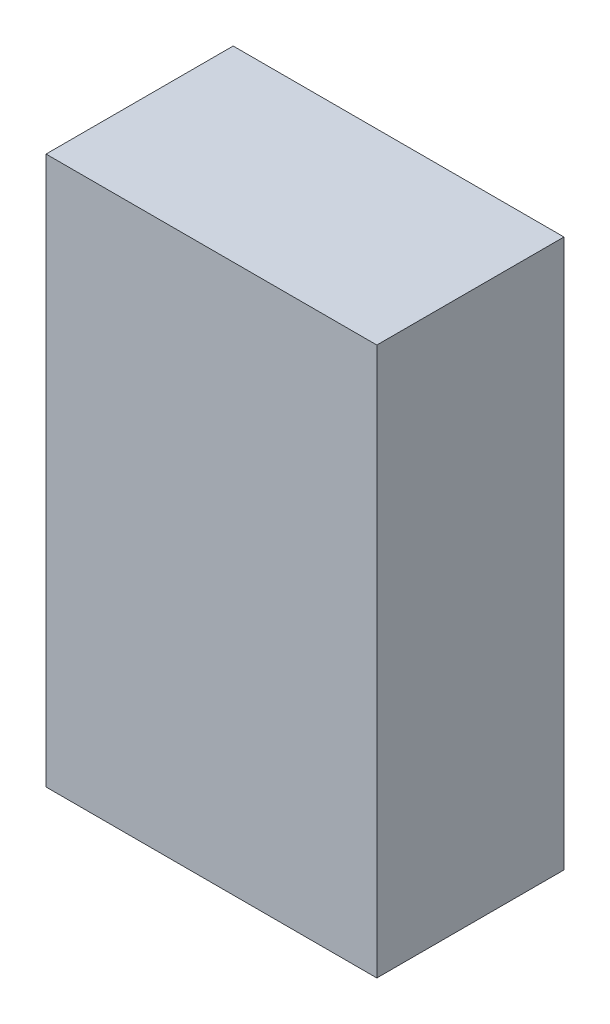
ISO-10303-21;
HEADER;
FILE_DESCRIPTION(('STEP AP214'),'2;1');
FILE_NAME('part.step','',(''),(''),'','','');
FILE_SCHEMA(('AUTOMOTIVE_DESIGN { 1 0 10303 214 1 1 1 1 }'));
ENDSEC;
DATA;
#1=APPLICATION_CONTEXT('core data for automotive mechanical design processes');
#2=APPLICATION_PROTOCOL_DEFINITION('international standard','automotive_design',2000,#1);
#3=PRODUCT_CONTEXT('',#1,'mechanical');
#4=PRODUCT('Part','Part','',(#3));
#5=PRODUCT_RELATED_PRODUCT_CATEGORY('part','',(#4));
#6=PRODUCT_DEFINITION_FORMATION('','',#4);
#7=PRODUCT_DEFINITION_CONTEXT('part definition',#1,'design');
#8=PRODUCT_DEFINITION('design','',#6,#7);
#9=PRODUCT_DEFINITION_SHAPE('','',#8);
#10=(LENGTH_UNIT() NAMED_UNIT(*) SI_UNIT(.MILLI.,.METRE.));
#11=(NAMED_UNIT(*) PLANE_ANGLE_UNIT() SI_UNIT($,.RADIAN.));
#12=(NAMED_UNIT(*) SI_UNIT($,.STERADIAN.) SOLID_ANGLE_UNIT());
#13=UNCERTAINTY_MEASURE_WITH_UNIT(LENGTH_MEASURE(1.E-05),#10,'distance_accuracy_value','');
#14=(GEOMETRIC_REPRESENTATION_CONTEXT(3) GLOBAL_UNCERTAINTY_ASSIGNED_CONTEXT((#13)) GLOBAL_UNIT_ASSIGNED_CONTEXT((#10,
#11,#12)) REPRESENTATION_CONTEXT('',''));
#15=CARTESIAN_POINT('',(0.,0.,0.));
#16=DIRECTION('',(0.,0.,1.));
#17=DIRECTION('',(1.,0.,0.));
#18=AXIS2_PLACEMENT_3D('',#15,#16,#17);
#19=CARTESIAN_POINT('',(0.87499952,1.44999964,0.00999998));
#20=DIRECTION('',(1.,0.,0.));
#21=DIRECTION('',(0.,-1.,0.));
#22=AXIS2_PLACEMENT_3D('',#19,#20,#21);
#23=PLANE('',#22);
#24=DIRECTION('',(0.,0.,1.));
#25=VECTOR('',#24,1.);
#26=CARTESIAN_POINT('',(0.87499952,1.44999964,0.00999998));
#27=LINE('',#26,#25);
#28=CARTESIAN_POINT('',(0.87499952,1.44999964,0.00999998));
#29=VERTEX_POINT('',#28);
#30=CARTESIAN_POINT('',(0.87499952,1.44999964,1.00000054));
#31=VERTEX_POINT('',#30);
#32=EDGE_CURVE('E10',#29,#31,#27,.T.);
#33=ORIENTED_EDGE('',*,*,#32,.T.);
#34=DIRECTION('',(0.,-1.,0.));
#35=VECTOR('',#34,1.);
#36=CARTESIAN_POINT('',(0.87499952,1.44999964,1.00000054));
#37=LINE('',#36,#35);
#38=CARTESIAN_POINT('',(0.87499952,-1.44999964,1.00000054));
#39=VERTEX_POINT('',#38);
#40=EDGE_CURVE('E23',#31,#39,#37,.T.);
#41=ORIENTED_EDGE('',*,*,#40,.T.);
#42=DIRECTION('',(0.,0.,1.));
#43=VECTOR('',#42,1.);
#44=CARTESIAN_POINT('',(0.87499952,-1.44999964,0.00999998));
#45=LINE('',#44,#43);
#46=CARTESIAN_POINT('',(0.87499952,-1.44999964,0.00999998));
#47=VERTEX_POINT('',#46);
#48=EDGE_CURVE('E83',#47,#39,#45,.T.);
#49=ORIENTED_EDGE('',*,*,#48,.F.);
#50=DIRECTION('',(0.,-1.,0.));
#51=VECTOR('',#50,1.);
#52=CARTESIAN_POINT('',(0.87499952,1.44999964,0.00999998));
#53=LINE('',#52,#51);
#54=EDGE_CURVE('E81',#29,#47,#53,.T.);
#55=ORIENTED_EDGE('',*,*,#54,.F.);
#56=EDGE_LOOP('',(#33,#41,#49,#55));
#57=FACE_BOUND('',#56,.T.);
#58=ADVANCED_FACE('F16',(#57),#23,.T.);
#59=CARTESIAN_POINT('',(0.87499952,-1.44999964,0.00999998));
#60=DIRECTION('',(0.,-1.,0.));
#61=DIRECTION('',(-1.,0.,0.));
#62=AXIS2_PLACEMENT_3D('',#59,#60,#61);
#63=PLANE('',#62);
#64=ORIENTED_EDGE('',*,*,#48,.T.);
#65=DIRECTION('',(-1.,0.,0.));
#66=VECTOR('',#65,1.);
#67=CARTESIAN_POINT('',(0.87499952,-1.44999964,1.00000054));
#68=LINE('',#67,#66);
#69=CARTESIAN_POINT('',(-0.87499952,-1.44999964,1.00000054));
#70=VERTEX_POINT('',#69);
#71=EDGE_CURVE('E78',#39,#70,#68,.T.);
#72=ORIENTED_EDGE('',*,*,#71,.T.);
#73=DIRECTION('',(0.,0.,1.));
#74=VECTOR('',#73,1.);
#75=CARTESIAN_POINT('',(-0.87499952,-1.44999964,0.00999998));
#76=LINE('',#75,#74);
#77=CARTESIAN_POINT('',(-0.87499952,-1.44999964,0.00999998));
#78=VERTEX_POINT('',#77);
#79=EDGE_CURVE('E76',#78,#70,#76,.T.);
#80=ORIENTED_EDGE('',*,*,#79,.F.);
#81=DIRECTION('',(-1.,0.,0.));
#82=VECTOR('',#81,1.);
#83=CARTESIAN_POINT('',(0.87499952,-1.44999964,0.00999998));
#84=LINE('',#83,#82);
#85=EDGE_CURVE('E67',#47,#78,#84,.T.);
#86=ORIENTED_EDGE('',*,*,#85,.F.);
#87=EDGE_LOOP('',(#64,#72,#80,#86));
#88=FACE_BOUND('',#87,.T.);
#89=ADVANCED_FACE('F89',(#88),#63,.T.);
#90=CARTESIAN_POINT('',(-0.87499952,-1.44999964,0.00999998));
#91=DIRECTION('',(-1.,0.,0.));
#92=DIRECTION('',(0.,1.,0.));
#93=AXIS2_PLACEMENT_3D('',#90,#91,#92);
#94=PLANE('',#93);
#95=ORIENTED_EDGE('',*,*,#79,.T.);
#96=DIRECTION('',(0.,1.,0.));
#97=VECTOR('',#96,1.);
#98=CARTESIAN_POINT('',(-0.87499952,-1.44999964,1.00000054));
#99=LINE('',#98,#97);
#100=CARTESIAN_POINT('',(-0.87499952,1.44999964,1.00000054));
#101=VERTEX_POINT('',#100);
#102=EDGE_CURVE('E59',#70,#101,#99,.T.);
#103=ORIENTED_EDGE('',*,*,#102,.T.);
#104=DIRECTION('',(0.,0.,1.));
#105=VECTOR('',#104,1.);
#106=CARTESIAN_POINT('',(-0.87499952,1.44999964,0.00999998));
#107=LINE('',#106,#105);
#108=CARTESIAN_POINT('',(-0.87499952,1.44999964,0.00999998));
#109=VERTEX_POINT('',#108);
#110=EDGE_CURVE('E53',#109,#101,#107,.T.);
#111=ORIENTED_EDGE('',*,*,#110,.F.);
#112=DIRECTION('',(0.,1.,0.));
#113=VECTOR('',#112,1.);
#114=CARTESIAN_POINT('',(-0.87499952,-1.44999964,0.00999998));
#115=LINE('',#114,#113);
#116=EDGE_CURVE('E57',#78,#109,#115,.T.);
#117=ORIENTED_EDGE('',*,*,#116,.F.);
#118=EDGE_LOOP('',(#95,#103,#111,#117));
#119=FACE_BOUND('',#118,.T.);
#120=ADVANCED_FACE('F56',(#119),#94,.T.);
#121=CARTESIAN_POINT('',(-0.87499952,1.44999964,0.00999998));
#122=DIRECTION('',(0.,1.,0.));
#123=DIRECTION('',(1.,0.,0.));
#124=AXIS2_PLACEMENT_3D('',#121,#122,#123);
#125=PLANE('',#124);
#126=ORIENTED_EDGE('',*,*,#110,.T.);
#127=DIRECTION('',(1.,0.,0.));
#128=VECTOR('',#127,1.);
#129=CARTESIAN_POINT('',(-0.87499952,1.44999964,1.00000054));
#130=LINE('',#129,#128);
#131=EDGE_CURVE('E68',#101,#31,#130,.T.);
#132=ORIENTED_EDGE('',*,*,#131,.T.);
#133=ORIENTED_EDGE('',*,*,#32,.F.);
#134=DIRECTION('',(1.,0.,0.));
#135=VECTOR('',#134,1.);
#136=CARTESIAN_POINT('',(-0.87499952,1.44999964,0.00999998));
#137=LINE('',#136,#135);
#138=EDGE_CURVE('E66',#109,#29,#137,.T.);
#139=ORIENTED_EDGE('',*,*,#138,.F.);
#140=EDGE_LOOP('',(#126,#132,#133,#139));
#141=FACE_BOUND('',#140,.T.);
#142=ADVANCED_FACE('F70',(#141),#125,.T.);
#143=CARTESIAN_POINT('',(0.,0.,0.00999998));
#144=DIRECTION('',(0.,0.,-1.));
#145=DIRECTION('',(0.,-1.,0.));
#146=AXIS2_PLACEMENT_3D('',#143,#144,#145);
#147=PLANE('',#146);
#148=ORIENTED_EDGE('',*,*,#54,.T.);
#149=ORIENTED_EDGE('',*,*,#85,.T.);
#150=ORIENTED_EDGE('',*,*,#116,.T.);
#151=ORIENTED_EDGE('',*,*,#138,.T.);
#152=EDGE_LOOP('',(#148,#149,#150,#151));
#153=FACE_BOUND('',#152,.T.);
#154=ADVANCED_FACE('F65',(#153),#147,.T.);
#155=CARTESIAN_POINT('',(0.,0.,1.00000054));
#156=DIRECTION('',(0.,0.,-1.));
#157=DIRECTION('',(0.,-1.,0.));
#158=AXIS2_PLACEMENT_3D('',#155,#156,#157);
#159=PLANE('',#158);
#160=ORIENTED_EDGE('',*,*,#131,.F.);
#161=ORIENTED_EDGE('',*,*,#102,.F.);
#162=ORIENTED_EDGE('',*,*,#71,.F.);
#163=ORIENTED_EDGE('',*,*,#40,.F.);
#164=EDGE_LOOP('',(#160,#161,#162,#163));
#165=FACE_BOUND('',#164,.T.);
#166=ADVANCED_FACE('F90',(#165),#159,.F.);
#167=CLOSED_SHELL('',(#58,#89,#120,#142,#154,#166));
#168=MANIFOLD_SOLID_BREP('B1',#167);
#169=ADVANCED_BREP_SHAPE_REPRESENTATION('',(#18,#168),#14);
#170=SHAPE_DEFINITION_REPRESENTATION(#9,#169);
ENDSEC;
END-ISO-10303-21;
